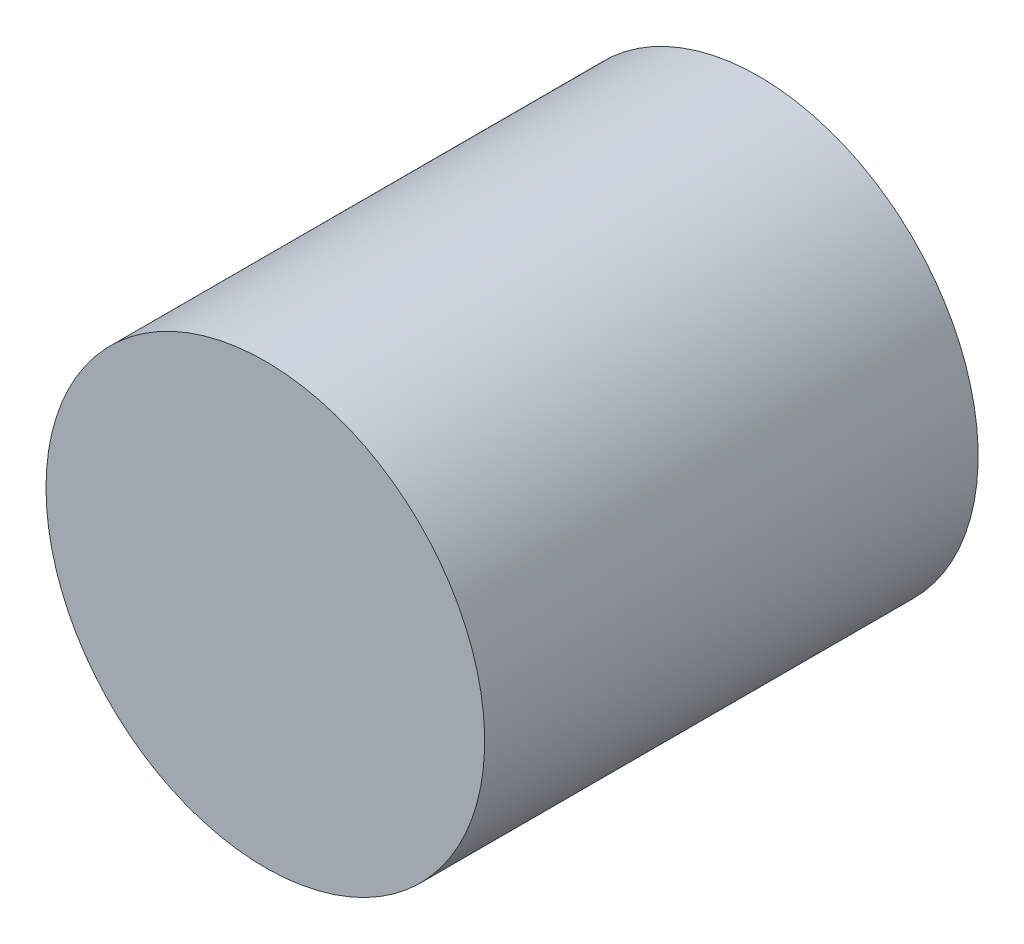
ISO-10303-21;
HEADER;
FILE_DESCRIPTION(('STEP AP214'),'2;1');
FILE_NAME('part.step','',(''),(''),'','','');
FILE_SCHEMA(('AUTOMOTIVE_DESIGN { 1 0 10303 214 1 1 1 1 }'));
ENDSEC;
DATA;
#1=APPLICATION_CONTEXT('core data for automotive mechanical design processes');
#2=APPLICATION_PROTOCOL_DEFINITION('international standard','automotive_design',2000,#1);
#3=PRODUCT_CONTEXT('',#1,'mechanical');
#4=PRODUCT('Part','Part','',(#3));
#5=PRODUCT_RELATED_PRODUCT_CATEGORY('part','',(#4));
#6=PRODUCT_DEFINITION_FORMATION('','',#4);
#7=PRODUCT_DEFINITION_CONTEXT('part definition',#1,'design');
#8=PRODUCT_DEFINITION('design','',#6,#7);
#9=PRODUCT_DEFINITION_SHAPE('','',#8);
#10=(LENGTH_UNIT() NAMED_UNIT(*) SI_UNIT(.MILLI.,.METRE.));
#11=(NAMED_UNIT(*) PLANE_ANGLE_UNIT() SI_UNIT($,.RADIAN.));
#12=(NAMED_UNIT(*) SI_UNIT($,.STERADIAN.) SOLID_ANGLE_UNIT());
#13=UNCERTAINTY_MEASURE_WITH_UNIT(LENGTH_MEASURE(1.E-05),#10,'distance_accuracy_value','');
#14=(GEOMETRIC_REPRESENTATION_CONTEXT(3) GLOBAL_UNCERTAINTY_ASSIGNED_CONTEXT((#13)) GLOBAL_UNIT_ASSIGNED_CONTEXT((#10,
#11,#12)) REPRESENTATION_CONTEXT('',''));
#15=CARTESIAN_POINT('',(0.,0.,0.));
#16=DIRECTION('',(0.,0.,1.));
#17=DIRECTION('',(1.,0.,0.));
#18=AXIS2_PLACEMENT_3D('',#15,#16,#17);
#19=CARTESIAN_POINT('',(0.,0.,45.));
#20=DIRECTION('',(0.,0.,-1.));
#21=DIRECTION('',(-1.,0.,0.));
#22=AXIS2_PLACEMENT_3D('',#19,#20,#21);
#23=CYLINDRICAL_SURFACE('',#22,20.);
#24=CARTESIAN_POINT('',(0.,0.,45.));
#25=DIRECTION('',(0.,0.,1.));
#26=DIRECTION('',(1.,0.,0.));
#27=AXIS2_PLACEMENT_3D('',#24,#25,#26);
#28=CIRCLE('',#27,20.);
#29=CARTESIAN_POINT('',(-20.,0.,45.));
#30=VERTEX_POINT('',#29);
#31=EDGE_CURVE('E10',#30,#30,#28,.T.);
#32=CARTESIAN_POINT('',(0.,0.,0.));
#33=DIRECTION('',(0.,0.,1.));
#34=DIRECTION('',(1.,0.,0.));
#35=AXIS2_PLACEMENT_3D('',#32,#33,#34);
#36=CIRCLE('',#35,20.);
#37=CARTESIAN_POINT('',(-20.,0.,0.));
#38=VERTEX_POINT('',#37);
#39=EDGE_CURVE('E38',#38,#38,#36,.T.);
#40=CARTESIAN_POINT('',(-20.,0.,45.));
#41=CARTESIAN_POINT('',(-20.,0.,44.53125));
#42=CARTESIAN_POINT('',(-20.,0.,44.0625));
#43=CARTESIAN_POINT('',(-20.,0.,43.125));
#44=CARTESIAN_POINT('',(-20.,0.,42.65625));
#45=CARTESIAN_POINT('',(-20.,0.,41.71875));
#46=CARTESIAN_POINT('',(-20.,0.,41.25));
#47=CARTESIAN_POINT('',(-20.,0.,40.3125));
#48=CARTESIAN_POINT('',(-20.,0.,39.84375));
#49=CARTESIAN_POINT('',(-20.,0.,38.90625));
#50=CARTESIAN_POINT('',(-20.,0.,38.4375));
#51=CARTESIAN_POINT('',(-20.,0.,37.5));
#52=CARTESIAN_POINT('',(-20.,0.,37.03125));
#53=CARTESIAN_POINT('',(-20.,0.,36.09375));
#54=CARTESIAN_POINT('',(-20.,0.,35.625));
#55=CARTESIAN_POINT('',(-20.,0.,34.6875));
#56=CARTESIAN_POINT('',(-20.,0.,34.21875));
#57=CARTESIAN_POINT('',(-20.,0.,33.28125));
#58=CARTESIAN_POINT('',(-20.,0.,32.8125));
#59=CARTESIAN_POINT('',(-20.,0.,31.875));
#60=CARTESIAN_POINT('',(-20.,0.,31.40625));
#61=CARTESIAN_POINT('',(-20.,0.,30.46875));
#62=CARTESIAN_POINT('',(-20.,0.,30.));
#63=CARTESIAN_POINT('',(-20.,0.,29.0625));
#64=CARTESIAN_POINT('',(-20.,0.,28.59375));
#65=CARTESIAN_POINT('',(-20.,0.,27.65625));
#66=CARTESIAN_POINT('',(-20.,0.,27.1875));
#67=CARTESIAN_POINT('',(-20.,0.,26.25));
#68=CARTESIAN_POINT('',(-20.,0.,25.78125));
#69=CARTESIAN_POINT('',(-20.,0.,24.84375));
#70=CARTESIAN_POINT('',(-20.,0.,24.375));
#71=CARTESIAN_POINT('',(-20.,0.,23.4375));
#72=CARTESIAN_POINT('',(-20.,0.,22.96875));
#73=CARTESIAN_POINT('',(-20.,0.,22.03125));
#74=CARTESIAN_POINT('',(-20.,0.,21.5625));
#75=CARTESIAN_POINT('',(-20.,0.,20.625));
#76=CARTESIAN_POINT('',(-20.,0.,20.15625));
#77=CARTESIAN_POINT('',(-20.,0.,19.21875));
#78=CARTESIAN_POINT('',(-20.,0.,18.75));
#79=CARTESIAN_POINT('',(-20.,0.,17.8125));
#80=CARTESIAN_POINT('',(-20.,0.,17.34375));
#81=CARTESIAN_POINT('',(-20.,0.,16.40625));
#82=CARTESIAN_POINT('',(-20.,0.,15.9375));
#83=CARTESIAN_POINT('',(-20.,0.,15.));
#84=CARTESIAN_POINT('',(-20.,0.,14.53125));
#85=CARTESIAN_POINT('',(-20.,0.,13.59375));
#86=CARTESIAN_POINT('',(-20.,0.,13.125));
#87=CARTESIAN_POINT('',(-20.,0.,12.1875));
#88=CARTESIAN_POINT('',(-20.,0.,11.71875));
#89=CARTESIAN_POINT('',(-20.,0.,10.78125));
#90=CARTESIAN_POINT('',(-20.,0.,10.3125));
#91=CARTESIAN_POINT('',(-20.,0.,9.37499999999999));
#92=CARTESIAN_POINT('',(-20.,0.,8.90624999999999));
#93=CARTESIAN_POINT('',(-20.,0.,7.96874999999999));
#94=CARTESIAN_POINT('',(-20.,0.,7.5));
#95=CARTESIAN_POINT('',(-20.,0.,6.56249999999999));
#96=CARTESIAN_POINT('',(-20.,0.,6.09374999999999));
#97=CARTESIAN_POINT('',(-20.,0.,5.15624999999999));
#98=CARTESIAN_POINT('',(-20.,0.,4.68749999999999));
#99=CARTESIAN_POINT('',(-20.,0.,3.74999999999999));
#100=CARTESIAN_POINT('',(-20.,0.,3.28124999999999));
#101=CARTESIAN_POINT('',(-20.,0.,2.34374999999999));
#102=CARTESIAN_POINT('',(-20.,0.,1.87499999999999));
#103=CARTESIAN_POINT('',(-20.,0.,0.937499999999992));
#104=CARTESIAN_POINT('',(-20.,0.,0.468749999999993));
#105=CARTESIAN_POINT('',(-20.,0.,0.));
#106=B_SPLINE_CURVE_WITH_KNOTS('',3,(#40,#41,#42,#43,#44,#45,#46,#47,#48,#49,#50,#51,#52,#53,
#54,#55,#56,#57,#58,#59,#60,#61,#62,#63,#64,#65,#66,#67,#68,#69,#70,#71,#72,#73,#74,#75,#76,#77,
#78,#79,#80,#81,#82,#83,#84,#85,#86,#87,#88,#89,#90,#91,#92,#93,#94,#95,#96,#97,#98,#99,#100,
#101,#102,#103,#104,#105),.UNSPECIFIED.,.F.,.F.,(4,2,2,2,2,2,2,2,2,2,2,2,2,2,2,2,2,2,2,2,2,2,2,
2,2,2,2,2,2,2,2,2,4),(0.,1.40625,2.8125,4.21874999999999,5.625,7.03125,8.43749999999999,9.84375,
11.25,12.65625,14.0625,15.46875,16.875,18.28125,19.6875,21.09375,22.5,23.90625,25.3125,26.71875,
28.125,29.53125,30.9375,32.34375,33.75,35.15625,36.5625,37.96875,39.375,40.78125,42.1875,
43.59375,45.),.UNSPECIFIED.);
#107=EDGE_CURVE('BSEAM35',#30,#38,#106,.T.);
#108=ORIENTED_EDGE('',*,*,#31,.F.);
#109=ORIENTED_EDGE('',*,*,#39,.T.);
#110=ORIENTED_EDGE('',*,*,#107,.T.);
#111=ORIENTED_EDGE('',*,*,#107,.F.);
#112=EDGE_LOOP('',(#108,#110,#109,#111));
#113=FACE_BOUND('',#112,.T.);
#114=ADVANCED_FACE('F35',(#113),#23,.T.);
#115=CARTESIAN_POINT('',(0.,0.,45.));
#116=DIRECTION('',(0.,0.,1.));
#117=DIRECTION('',(1.,0.,0.));
#118=AXIS2_PLACEMENT_3D('',#115,#116,#117);
#119=PLANE('',#118);
#120=ORIENTED_EDGE('',*,*,#31,.T.);
#121=EDGE_LOOP('',(#120));
#122=FACE_BOUND('',#121,.T.);
#123=ADVANCED_FACE('F50',(#122),#119,.T.);
#124=CARTESIAN_POINT('',(0.,0.,0.));
#125=DIRECTION('',(0.,0.,1.));
#126=DIRECTION('',(1.,0.,0.));
#127=AXIS2_PLACEMENT_3D('',#124,#125,#126);
#128=PLANE('',#127);
#129=ORIENTED_EDGE('',*,*,#39,.F.);
#130=EDGE_LOOP('',(#129));
#131=FACE_BOUND('',#130,.T.);
#132=ADVANCED_FACE('F48',(#131),#128,.F.);
#133=CLOSED_SHELL('',(#114,#123,#132));
#134=MANIFOLD_SOLID_BREP('B2',#133);
#135=ADVANCED_BREP_SHAPE_REPRESENTATION('',(#18,#134),#14);
#136=SHAPE_DEFINITION_REPRESENTATION(#9,#135);
ENDSEC;
END-ISO-10303-21;
